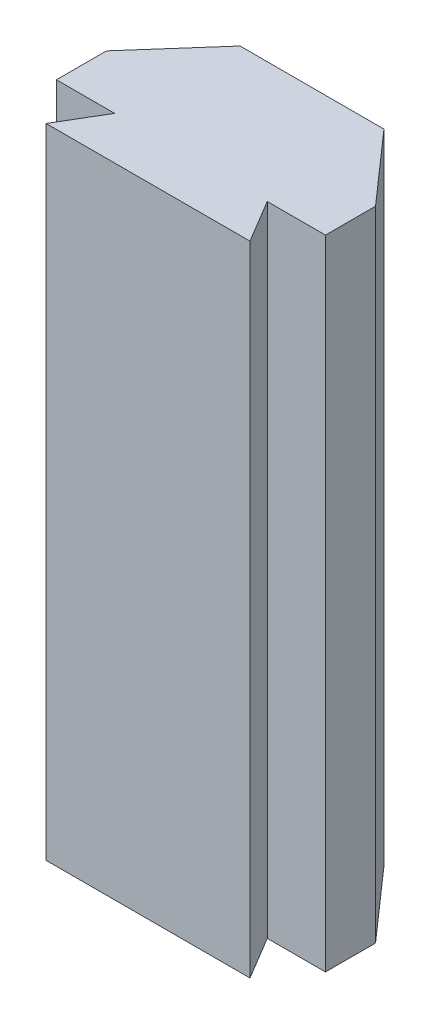
ISO-10303-21;
HEADER;
FILE_DESCRIPTION(('STEP AP214'),'2;1');
FILE_NAME('part.step','',(''),(''),'','','');
FILE_SCHEMA(('AUTOMOTIVE_DESIGN { 1 0 10303 214 1 1 1 1 }'));
ENDSEC;
DATA;
#1=APPLICATION_CONTEXT('core data for automotive mechanical design processes');
#2=APPLICATION_PROTOCOL_DEFINITION('international standard','automotive_design',2000,#1);
#3=PRODUCT_CONTEXT('',#1,'mechanical');
#4=PRODUCT('Part','Part','',(#3));
#5=PRODUCT_RELATED_PRODUCT_CATEGORY('part','',(#4));
#6=PRODUCT_DEFINITION_FORMATION('','',#4);
#7=PRODUCT_DEFINITION_CONTEXT('part definition',#1,'design');
#8=PRODUCT_DEFINITION('design','',#6,#7);
#9=PRODUCT_DEFINITION_SHAPE('','',#8);
#10=(LENGTH_UNIT() NAMED_UNIT(*) SI_UNIT(.MILLI.,.METRE.));
#11=(NAMED_UNIT(*) PLANE_ANGLE_UNIT() SI_UNIT($,.RADIAN.));
#12=(NAMED_UNIT(*) SI_UNIT($,.STERADIAN.) SOLID_ANGLE_UNIT());
#13=UNCERTAINTY_MEASURE_WITH_UNIT(LENGTH_MEASURE(1.E-05),#10,'distance_accuracy_value','');
#14=(GEOMETRIC_REPRESENTATION_CONTEXT(3) GLOBAL_UNCERTAINTY_ASSIGNED_CONTEXT((#13)) GLOBAL_UNIT_ASSIGNED_CONTEXT((#10,
#11,#12)) REPRESENTATION_CONTEXT('',''));
#15=CARTESIAN_POINT('',(0.,0.,0.));
#16=DIRECTION('',(0.,0.,1.));
#17=DIRECTION('',(1.,0.,0.));
#18=AXIS2_PLACEMENT_3D('',#15,#16,#17);
#19=CARTESIAN_POINT('',(-7.69057725749299,25.5,-2.8375876221032));
#20=DIRECTION('',(0.750240388123715,0.,0.661165153367884));
#21=DIRECTION('',(0.661165153367884,0.,-0.750240388123715));
#22=AXIS2_PLACEMENT_3D('',#19,#20,#21);
#23=PLANE('',#22);
#24=DIRECTION('',(-0.661165153367884,0.,0.750240388123715));
#25=VECTOR('',#24,1.);
#26=CARTESIAN_POINT('',(-7.69057725749299,0.,-2.8375876221032));
#27=LINE('',#26,#25);
#28=CARTESIAN_POINT('',(-5.19057725749299,0.,-5.67439921260405));
#29=VERTEX_POINT('',#28);
#30=CARTESIAN_POINT('',(-7.69057725749299,0.,-2.8375876221032));
#31=VERTEX_POINT('',#30);
#32=EDGE_CURVE('E141',#29,#31,#27,.T.);
#33=ORIENTED_EDGE('',*,*,#32,.T.);
#34=DIRECTION('',(0.,-1.,0.));
#35=VECTOR('',#34,1.);
#36=CARTESIAN_POINT('',(-7.69057725749299,25.5,-2.8375876221032));
#37=LINE('',#36,#35);
#38=CARTESIAN_POINT('',(-7.69057725749299,25.5,-2.8375876221032));
#39=VERTEX_POINT('',#38);
#40=EDGE_CURVE('E11',#39,#31,#37,.T.);
#41=ORIENTED_EDGE('',*,*,#40,.F.);
#42=DIRECTION('',(-0.661165153367884,0.,0.750240388123715));
#43=VECTOR('',#42,1.);
#44=CARTESIAN_POINT('',(-7.69057725749299,25.5,-2.8375876221032));
#45=LINE('',#44,#43);
#46=CARTESIAN_POINT('',(-5.19057725749299,25.5,-5.67439921260405));
#47=VERTEX_POINT('',#46);
#48=EDGE_CURVE('E159',#47,#39,#45,.T.);
#49=ORIENTED_EDGE('',*,*,#48,.F.);
#50=DIRECTION('',(0.,-1.,0.));
#51=VECTOR('',#50,1.);
#52=CARTESIAN_POINT('',(-5.19057725749299,25.5,-5.67439921260405));
#53=LINE('',#52,#51);
#54=EDGE_CURVE('E137',#47,#29,#53,.T.);
#55=ORIENTED_EDGE('',*,*,#54,.T.);
#56=EDGE_LOOP('',(#33,#41,#49,#55));
#57=FACE_BOUND('',#56,.T.);
#58=ADVANCED_FACE('F33',(#57),#23,.F.);
#59=CARTESIAN_POINT('',(-7.69057725749299,25.5,-0.837587622103197));
#60=DIRECTION('',(1.,0.,0.));
#61=DIRECTION('',(0.,0.,-1.));
#62=AXIS2_PLACEMENT_3D('',#59,#60,#61);
#63=PLANE('',#62);
#64=DIRECTION('',(0.,0.,1.));
#65=VECTOR('',#64,1.);
#66=CARTESIAN_POINT('',(-7.69057725749299,0.,-0.837587622103197));
#67=LINE('',#66,#65);
#68=CARTESIAN_POINT('',(-7.69057725749299,0.,-0.837587622103197));
#69=VERTEX_POINT('',#68);
#70=EDGE_CURVE('E144',#31,#69,#67,.T.);
#71=ORIENTED_EDGE('',*,*,#70,.T.);
#72=DIRECTION('',(0.,-1.,0.));
#73=VECTOR('',#72,1.);
#74=CARTESIAN_POINT('',(-7.69057725749299,25.5,-0.837587622103197));
#75=LINE('',#74,#73);
#76=CARTESIAN_POINT('',(-7.69057725749299,25.5,-0.837587622103197));
#77=VERTEX_POINT('',#76);
#78=EDGE_CURVE('E41',#77,#69,#75,.T.);
#79=ORIENTED_EDGE('',*,*,#78,.F.);
#80=DIRECTION('',(0.,0.,1.));
#81=VECTOR('',#80,1.);
#82=CARTESIAN_POINT('',(-7.69057725749299,25.5,-0.837587622103197));
#83=LINE('',#82,#81);
#84=EDGE_CURVE('E98',#39,#77,#83,.T.);
#85=ORIENTED_EDGE('',*,*,#84,.F.);
#86=ORIENTED_EDGE('',*,*,#40,.T.);
#87=EDGE_LOOP('',(#71,#79,#85,#86));
#88=FACE_BOUND('',#87,.T.);
#89=ADVANCED_FACE('F208',(#88),#63,.F.);
#90=CARTESIAN_POINT('',(-5.36557725749299,25.5,-0.837587622103195));
#91=DIRECTION('',(0.,0.,-1.));
#92=DIRECTION('',(-1.,0.,0.));
#93=AXIS2_PLACEMENT_3D('',#90,#91,#92);
#94=PLANE('',#93);
#95=DIRECTION('',(1.,0.,0.));
#96=VECTOR('',#95,1.);
#97=CARTESIAN_POINT('',(-5.36557725749299,0.,-0.837587622103195));
#98=LINE('',#97,#96);
#99=CARTESIAN_POINT('',(-5.36557725749299,0.,-0.837587622103195));
#100=VERTEX_POINT('',#99);
#101=EDGE_CURVE('E146',#69,#100,#98,.T.);
#102=ORIENTED_EDGE('',*,*,#101,.T.);
#103=DIRECTION('',(0.,-1.,0.));
#104=VECTOR('',#103,1.);
#105=CARTESIAN_POINT('',(-5.36557725749299,25.5,-0.837587622103195));
#106=LINE('',#105,#104);
#107=CARTESIAN_POINT('',(-5.36557725749299,25.5,-0.837587622103195));
#108=VERTEX_POINT('',#107);
#109=EDGE_CURVE('E172',#108,#100,#106,.T.);
#110=ORIENTED_EDGE('',*,*,#109,.F.);
#111=DIRECTION('',(1.,0.,0.));
#112=VECTOR('',#111,1.);
#113=CARTESIAN_POINT('',(-5.36557725749299,25.5,-0.837587622103195));
#114=LINE('',#113,#112);
#115=EDGE_CURVE('E180',#77,#108,#114,.T.);
#116=ORIENTED_EDGE('',*,*,#115,.F.);
#117=ORIENTED_EDGE('',*,*,#78,.T.);
#118=EDGE_LOOP('',(#102,#110,#116,#117));
#119=FACE_BOUND('',#118,.T.);
#120=ADVANCED_FACE('F178',(#119),#94,.F.);
#121=CARTESIAN_POINT('',(-6.38577760534575,25.5,0.882642377123977));
#122=DIRECTION('',(0.860114999613586,0.,0.510100173926378));
#123=DIRECTION('',(0.510100173926378,0.,-0.860114999613586));
#124=AXIS2_PLACEMENT_3D('',#121,#122,#123);
#125=PLANE('',#124);
#126=DIRECTION('',(-0.510100173926378,0.,0.860114999613586));
#127=VECTOR('',#126,1.);
#128=CARTESIAN_POINT('',(-6.38577760534575,0.,0.882642377123977));
#129=LINE('',#128,#127);
#130=CARTESIAN_POINT('',(-6.38577760534575,0.,0.882642377123977));
#131=VERTEX_POINT('',#130);
#132=EDGE_CURVE('E148',#100,#131,#129,.T.);
#133=ORIENTED_EDGE('',*,*,#132,.T.);
#134=DIRECTION('',(0.,-1.,0.));
#135=VECTOR('',#134,1.);
#136=CARTESIAN_POINT('',(-6.38577760534575,25.5,0.882642377123977));
#137=LINE('',#136,#135);
#138=CARTESIAN_POINT('',(-6.38577760534575,25.5,0.882642377123977));
#139=VERTEX_POINT('',#138);
#140=EDGE_CURVE('E169',#139,#131,#137,.T.);
#141=ORIENTED_EDGE('',*,*,#140,.F.);
#142=DIRECTION('',(-0.510100173926378,0.,0.860114999613586));
#143=VECTOR('',#142,1.);
#144=CARTESIAN_POINT('',(-6.38577760534575,25.5,0.882642377123977));
#145=LINE('',#144,#143);
#146=EDGE_CURVE('E198',#108,#139,#145,.T.);
#147=ORIENTED_EDGE('',*,*,#146,.F.);
#148=ORIENTED_EDGE('',*,*,#109,.T.);
#149=EDGE_LOOP('',(#133,#141,#147,#148));
#150=FACE_BOUND('',#149,.T.);
#151=ADVANCED_FACE('F189',(#150),#125,.F.);
#152=CARTESIAN_POINT('',(1.759422742507,25.5,0.879786827456361));
#153=DIRECTION('',(-0.000350580632787692,0.,-0.999999938546608));
#154=DIRECTION('',(-0.999999938546608,0.,0.000350580632787692));
#155=AXIS2_PLACEMENT_3D('',#152,#153,#154);
#156=PLANE('',#155);
#157=DIRECTION('',(0.999999938546608,0.,-0.000350580632787692));
#158=VECTOR('',#157,1.);
#159=CARTESIAN_POINT('',(1.759422742507,0.,0.879786827456361));
#160=LINE('',#159,#158);
#161=CARTESIAN_POINT('',(1.759422742507,0.,0.879786827456361));
#162=VERTEX_POINT('',#161);
#163=EDGE_CURVE('E150',#131,#162,#160,.T.);
#164=ORIENTED_EDGE('',*,*,#163,.T.);
#165=DIRECTION('',(0.,-1.,0.));
#166=VECTOR('',#165,1.);
#167=CARTESIAN_POINT('',(1.759422742507,25.5,0.879786827456361));
#168=LINE('',#167,#166);
#169=CARTESIAN_POINT('',(1.759422742507,25.5,0.879786827456361));
#170=VERTEX_POINT('',#169);
#171=EDGE_CURVE('E166',#170,#162,#168,.T.);
#172=ORIENTED_EDGE('',*,*,#171,.F.);
#173=DIRECTION('',(0.999999938546608,0.,-0.000350580632787692));
#174=VECTOR('',#173,1.);
#175=CARTESIAN_POINT('',(1.759422742507,25.5,0.879786827456361));
#176=LINE('',#175,#174);
#177=EDGE_CURVE('E195',#139,#170,#176,.T.);
#178=ORIENTED_EDGE('',*,*,#177,.F.);
#179=ORIENTED_EDGE('',*,*,#140,.T.);
#180=EDGE_LOOP('',(#164,#172,#178,#179));
#181=FACE_BOUND('',#180,.T.);
#182=ADVANCED_FACE('F193',(#181),#156,.F.);
#183=CARTESIAN_POINT('',(0.734422742507004,25.5,-0.837587622103197));
#184=DIRECTION('',(-0.85868722477978,0.,0.5125));
#185=DIRECTION('',(0.5125,0.,0.85868722477978));
#186=AXIS2_PLACEMENT_3D('',#183,#184,#185);
#187=PLANE('',#186);
#188=DIRECTION('',(-0.5125,0.,-0.85868722477978));
#189=VECTOR('',#188,1.);
#190=CARTESIAN_POINT('',(0.734422742507004,0.,-0.837587622103197));
#191=LINE('',#190,#189);
#192=CARTESIAN_POINT('',(0.734422742507004,0.,-0.837587622103197));
#193=VERTEX_POINT('',#192);
#194=EDGE_CURVE('E152',#162,#193,#191,.T.);
#195=ORIENTED_EDGE('',*,*,#194,.T.);
#196=DIRECTION('',(0.,-1.,0.));
#197=VECTOR('',#196,1.);
#198=CARTESIAN_POINT('',(0.734422742507004,25.5,-0.837587622103197));
#199=LINE('',#198,#197);
#200=CARTESIAN_POINT('',(0.734422742507004,25.5,-0.837587622103197));
#201=VERTEX_POINT('',#200);
#202=EDGE_CURVE('E163',#201,#193,#199,.T.);
#203=ORIENTED_EDGE('',*,*,#202,.F.);
#204=DIRECTION('',(-0.5125,0.,-0.85868722477978));
#205=VECTOR('',#204,1.);
#206=CARTESIAN_POINT('',(0.734422742507004,25.5,-0.837587622103197));
#207=LINE('',#206,#205);
#208=EDGE_CURVE('E197',#170,#201,#207,.T.);
#209=ORIENTED_EDGE('',*,*,#208,.F.);
#210=ORIENTED_EDGE('',*,*,#171,.T.);
#211=EDGE_LOOP('',(#195,#203,#209,#210));
#212=FACE_BOUND('',#211,.T.);
#213=ADVANCED_FACE('F220',(#212),#187,.F.);
#214=CARTESIAN_POINT('',(3.059422742507,25.5,-0.837587622103197));
#215=DIRECTION('',(0.,0.,-1.));
#216=DIRECTION('',(-1.,0.,0.));
#217=AXIS2_PLACEMENT_3D('',#214,#215,#216);
#218=PLANE('',#217);
#219=DIRECTION('',(1.,0.,0.));
#220=VECTOR('',#219,1.);
#221=CARTESIAN_POINT('',(3.059422742507,0.,-0.837587622103197));
#222=LINE('',#221,#220);
#223=CARTESIAN_POINT('',(3.059422742507,0.,-0.837587622103197));
#224=VERTEX_POINT('',#223);
#225=EDGE_CURVE('E154',#193,#224,#222,.T.);
#226=ORIENTED_EDGE('',*,*,#225,.T.);
#227=DIRECTION('',(0.,-1.,0.));
#228=VECTOR('',#227,1.);
#229=CARTESIAN_POINT('',(3.059422742507,25.5,-0.837587622103197));
#230=LINE('',#229,#228);
#231=CARTESIAN_POINT('',(3.059422742507,25.5,-0.837587622103197));
#232=VERTEX_POINT('',#231);
#233=EDGE_CURVE('E132',#232,#224,#230,.T.);
#234=ORIENTED_EDGE('',*,*,#233,.F.);
#235=DIRECTION('',(1.,0.,0.));
#236=VECTOR('',#235,1.);
#237=CARTESIAN_POINT('',(3.059422742507,25.5,-0.837587622103197));
#238=LINE('',#237,#236);
#239=EDGE_CURVE('E123',#201,#232,#238,.T.);
#240=ORIENTED_EDGE('',*,*,#239,.F.);
#241=ORIENTED_EDGE('',*,*,#202,.T.);
#242=EDGE_LOOP('',(#226,#234,#240,#241));
#243=FACE_BOUND('',#242,.T.);
#244=ADVANCED_FACE('F223',(#243),#218,.F.);
#245=CARTESIAN_POINT('',(3.05942274250701,25.5,-2.8375876221032));
#246=DIRECTION('',(-1.,0.,0.));
#247=DIRECTION('',(0.,0.,1.));
#248=AXIS2_PLACEMENT_3D('',#245,#246,#247);
#249=PLANE('',#248);
#250=DIRECTION('',(0.,0.,-1.));
#251=VECTOR('',#250,1.);
#252=CARTESIAN_POINT('',(3.05942274250701,0.,-2.8375876221032));
#253=LINE('',#252,#251);
#254=CARTESIAN_POINT('',(3.05942274250701,0.,-2.8375876221032));
#255=VERTEX_POINT('',#254);
#256=EDGE_CURVE('E131',#224,#255,#253,.T.);
#257=ORIENTED_EDGE('',*,*,#256,.T.);
#258=DIRECTION('',(0.,-1.,0.));
#259=VECTOR('',#258,1.);
#260=CARTESIAN_POINT('',(3.05942274250701,25.5,-2.8375876221032));
#261=LINE('',#260,#259);
#262=CARTESIAN_POINT('',(3.05942274250701,25.5,-2.8375876221032));
#263=VERTEX_POINT('',#262);
#264=EDGE_CURVE('E128',#263,#255,#261,.T.);
#265=ORIENTED_EDGE('',*,*,#264,.F.);
#266=DIRECTION('',(0.,0.,-1.));
#267=VECTOR('',#266,1.);
#268=CARTESIAN_POINT('',(3.05942274250701,25.5,-2.8375876221032));
#269=LINE('',#268,#267);
#270=EDGE_CURVE('E117',#232,#263,#269,.T.);
#271=ORIENTED_EDGE('',*,*,#270,.F.);
#272=ORIENTED_EDGE('',*,*,#233,.T.);
#273=EDGE_LOOP('',(#257,#265,#271,#272));
#274=FACE_BOUND('',#273,.T.);
#275=ADVANCED_FACE('F129',(#274),#249,.F.);
#276=CARTESIAN_POINT('',(0.559422742507004,25.5,-5.67439921260405));
#277=DIRECTION('',(-0.750240388123715,0.,0.661165153367884));
#278=DIRECTION('',(0.661165153367884,0.,0.750240388123715));
#279=AXIS2_PLACEMENT_3D('',#276,#277,#278);
#280=PLANE('',#279);
#281=DIRECTION('',(-0.661165153367884,0.,-0.750240388123715));
#282=VECTOR('',#281,1.);
#283=CARTESIAN_POINT('',(0.559422742507004,0.,-5.67439921260405));
#284=LINE('',#283,#282);
#285=CARTESIAN_POINT('',(0.559422742507004,0.,-5.67439921260405));
#286=VERTEX_POINT('',#285);
#287=EDGE_CURVE('E84',#255,#286,#284,.T.);
#288=ORIENTED_EDGE('',*,*,#287,.T.);
#289=DIRECTION('',(0.,-1.,0.));
#290=VECTOR('',#289,1.);
#291=CARTESIAN_POINT('',(0.559422742507004,25.5,-5.67439921260405));
#292=LINE('',#291,#290);
#293=CARTESIAN_POINT('',(0.559422742507004,25.5,-5.67439921260405));
#294=VERTEX_POINT('',#293);
#295=EDGE_CURVE('E133',#294,#286,#292,.T.);
#296=ORIENTED_EDGE('',*,*,#295,.F.);
#297=DIRECTION('',(-0.661165153367884,0.,-0.750240388123715));
#298=VECTOR('',#297,1.);
#299=CARTESIAN_POINT('',(0.559422742507004,25.5,-5.67439921260405));
#300=LINE('',#299,#298);
#301=EDGE_CURVE('E121',#263,#294,#300,.T.);
#302=ORIENTED_EDGE('',*,*,#301,.F.);
#303=ORIENTED_EDGE('',*,*,#264,.T.);
#304=EDGE_LOOP('',(#288,#296,#302,#303));
#305=FACE_BOUND('',#304,.T.);
#306=ADVANCED_FACE('F135',(#305),#280,.F.);
#307=CARTESIAN_POINT('',(-5.19057725749299,25.5,-5.67439921260405));
#308=DIRECTION('',(0.,0.,1.));
#309=DIRECTION('',(1.,0.,0.));
#310=AXIS2_PLACEMENT_3D('',#307,#308,#309);
#311=PLANE('',#310);
#312=DIRECTION('',(-1.,0.,0.));
#313=VECTOR('',#312,1.);
#314=CARTESIAN_POINT('',(-5.19057725749299,0.,-5.67439921260405));
#315=LINE('',#314,#313);
#316=EDGE_CURVE('E90',#286,#29,#315,.T.);
#317=ORIENTED_EDGE('',*,*,#316,.T.);
#318=ORIENTED_EDGE('',*,*,#54,.F.);
#319=DIRECTION('',(-1.,0.,0.));
#320=VECTOR('',#319,1.);
#321=CARTESIAN_POINT('',(-5.19057725749299,25.5,-5.67439921260405));
#322=LINE('',#321,#320);
#323=EDGE_CURVE('E49',#294,#47,#322,.T.);
#324=ORIENTED_EDGE('',*,*,#323,.F.);
#325=ORIENTED_EDGE('',*,*,#295,.T.);
#326=EDGE_LOOP('',(#317,#318,#324,#325));
#327=FACE_BOUND('',#326,.T.);
#328=ADVANCED_FACE('F232',(#327),#311,.F.);
#329=CARTESIAN_POINT('',(0.,25.5,0.));
#330=DIRECTION('',(0.,-1.,0.));
#331=DIRECTION('',(0.,0.,-1.));
#332=AXIS2_PLACEMENT_3D('',#329,#330,#331);
#333=PLANE('',#332);
#334=ORIENTED_EDGE('',*,*,#48,.T.);
#335=ORIENTED_EDGE('',*,*,#84,.T.);
#336=ORIENTED_EDGE('',*,*,#115,.T.);
#337=ORIENTED_EDGE('',*,*,#146,.T.);
#338=ORIENTED_EDGE('',*,*,#177,.T.);
#339=ORIENTED_EDGE('',*,*,#208,.T.);
#340=ORIENTED_EDGE('',*,*,#239,.T.);
#341=ORIENTED_EDGE('',*,*,#270,.T.);
#342=ORIENTED_EDGE('',*,*,#301,.T.);
#343=ORIENTED_EDGE('',*,*,#323,.T.);
#344=EDGE_LOOP('',(#334,#335,#336,#337,#338,#339,#340,#341,#342,#343));
#345=FACE_BOUND('',#344,.T.);
#346=ADVANCED_FACE('F119',(#345),#333,.F.);
#347=CARTESIAN_POINT('',(0.,0.,0.));
#348=DIRECTION('',(0.,-1.,0.));
#349=DIRECTION('',(0.,0.,-1.));
#350=AXIS2_PLACEMENT_3D('',#347,#348,#349);
#351=PLANE('',#350);
#352=ORIENTED_EDGE('',*,*,#32,.F.);
#353=ORIENTED_EDGE('',*,*,#316,.F.);
#354=ORIENTED_EDGE('',*,*,#287,.F.);
#355=ORIENTED_EDGE('',*,*,#256,.F.);
#356=ORIENTED_EDGE('',*,*,#225,.F.);
#357=ORIENTED_EDGE('',*,*,#194,.F.);
#358=ORIENTED_EDGE('',*,*,#163,.F.);
#359=ORIENTED_EDGE('',*,*,#132,.F.);
#360=ORIENTED_EDGE('',*,*,#101,.F.);
#361=ORIENTED_EDGE('',*,*,#70,.F.);
#362=EDGE_LOOP('',(#352,#353,#354,#355,#356,#357,#358,#359,#360,#361));
#363=FACE_BOUND('',#362,.T.);
#364=ADVANCED_FACE('F184',(#363),#351,.T.);
#365=CLOSED_SHELL('',(#58,#89,#120,#151,#182,#213,#244,#275,#306,#328,#346,#364));
#366=MANIFOLD_SOLID_BREP('B2',#365);
#367=ADVANCED_BREP_SHAPE_REPRESENTATION('',(#18,#366),#14);
#368=SHAPE_DEFINITION_REPRESENTATION(#9,#367);
ENDSEC;
END-ISO-10303-21;
